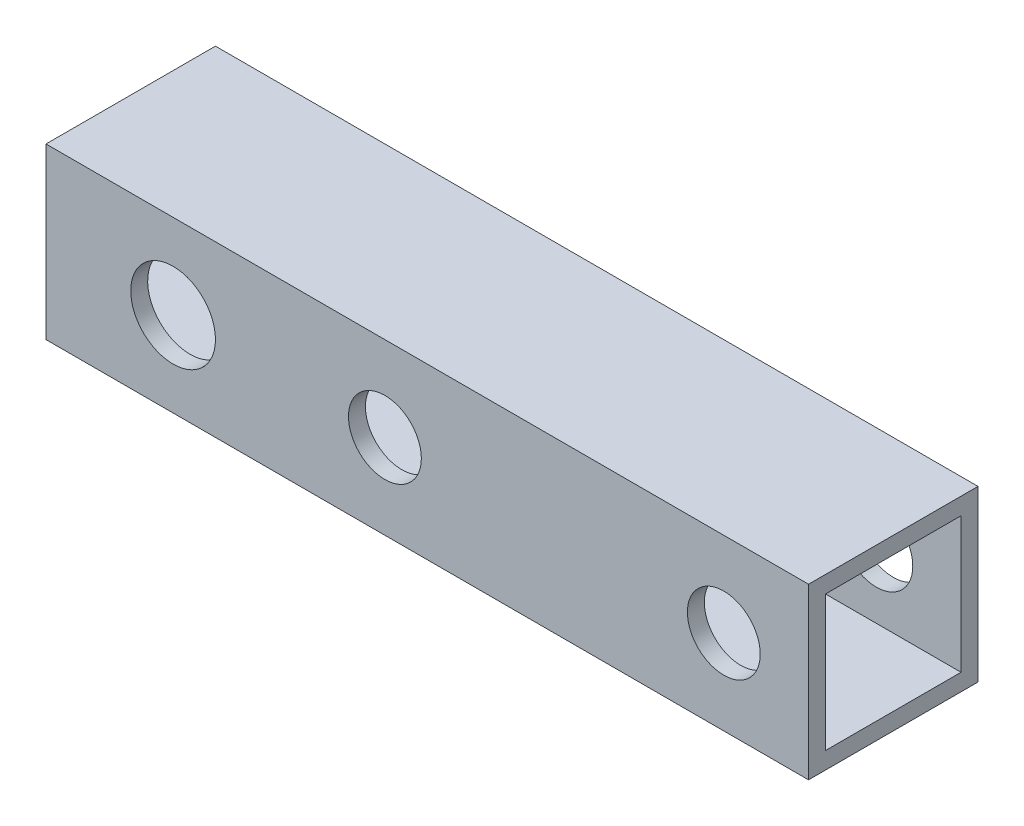
ISO-10303-21;
HEADER;
FILE_DESCRIPTION(('STEP AP214'),'2;1');
FILE_NAME('part.step','',(''),(''),'','','');
FILE_SCHEMA(('AUTOMOTIVE_DESIGN { 1 0 10303 214 1 1 1 1 }'));
ENDSEC;
DATA;
#1=APPLICATION_CONTEXT('core data for automotive mechanical design processes');
#2=APPLICATION_PROTOCOL_DEFINITION('international standard','automotive_design',2000,#1);
#3=PRODUCT_CONTEXT('',#1,'mechanical');
#4=PRODUCT('Part','Part','',(#3));
#5=PRODUCT_RELATED_PRODUCT_CATEGORY('part','',(#4));
#6=PRODUCT_DEFINITION_FORMATION('','',#4);
#7=PRODUCT_DEFINITION_CONTEXT('part definition',#1,'design');
#8=PRODUCT_DEFINITION('design','',#6,#7);
#9=PRODUCT_DEFINITION_SHAPE('','',#8);
#10=(LENGTH_UNIT() NAMED_UNIT(*) SI_UNIT(.MILLI.,.METRE.));
#11=(NAMED_UNIT(*) PLANE_ANGLE_UNIT() SI_UNIT($,.RADIAN.));
#12=(NAMED_UNIT(*) SI_UNIT($,.STERADIAN.) SOLID_ANGLE_UNIT());
#13=UNCERTAINTY_MEASURE_WITH_UNIT(LENGTH_MEASURE(1.E-05),#10,'distance_accuracy_value','');
#14=(GEOMETRIC_REPRESENTATION_CONTEXT(3) GLOBAL_UNCERTAINTY_ASSIGNED_CONTEXT((#13)) GLOBAL_UNIT_ASSIGNED_CONTEXT((#10,
#11,#12)) REPRESENTATION_CONTEXT('',''));
#15=CARTESIAN_POINT('',(0.,0.,0.));
#16=DIRECTION('',(0.,0.,1.));
#17=DIRECTION('',(1.,0.,0.));
#18=AXIS2_PLACEMENT_3D('',#15,#16,#17);
#19=CARTESIAN_POINT('',(45.,0.,0.));
#20=DIRECTION('',(1.,0.,0.));
#21=DIRECTION('',(0.,0.,-1.));
#22=AXIS2_PLACEMENT_3D('',#19,#20,#21);
#23=PLANE('',#22);
#24=DIRECTION('',(0.,1.,0.));
#25=VECTOR('',#24,1.);
#26=CARTESIAN_POINT('',(45.,5.,-5.));
#27=LINE('',#26,#25);
#28=CARTESIAN_POINT('',(45.,-5.,-5.));
#29=VERTEX_POINT('',#28);
#30=CARTESIAN_POINT('',(45.,5.,-5.));
#31=VERTEX_POINT('',#30);
#32=EDGE_CURVE('E164',#29,#31,#27,.T.);
#33=ORIENTED_EDGE('',*,*,#32,.T.);
#34=DIRECTION('',(0.,0.,1.));
#35=VECTOR('',#34,1.);
#36=CARTESIAN_POINT('',(45.,5.,5.));
#37=LINE('',#36,#35);
#38=CARTESIAN_POINT('',(45.,5.,5.));
#39=VERTEX_POINT('',#38);
#40=EDGE_CURVE('E167',#31,#39,#37,.T.);
#41=ORIENTED_EDGE('',*,*,#40,.T.);
#42=DIRECTION('',(0.,-1.,0.));
#43=VECTOR('',#42,1.);
#44=CARTESIAN_POINT('',(45.,5.,5.));
#45=LINE('',#44,#43);
#46=CARTESIAN_POINT('',(45.,-5.,5.));
#47=VERTEX_POINT('',#46);
#48=EDGE_CURVE('E170',#39,#47,#45,.T.);
#49=ORIENTED_EDGE('',*,*,#48,.T.);
#50=DIRECTION('',(0.,0.,-1.));
#51=VECTOR('',#50,1.);
#52=CARTESIAN_POINT('',(45.,-5.,5.));
#53=LINE('',#52,#51);
#54=EDGE_CURVE('E172',#47,#29,#53,.T.);
#55=ORIENTED_EDGE('',*,*,#54,.T.);
#56=EDGE_LOOP('',(#33,#41,#49,#55));
#57=FACE_BOUND('',#56,.T.);
#58=DIRECTION('',(0.,0.,1.));
#59=VECTOR('',#58,1.);
#60=CARTESIAN_POINT('',(45.,4.,5.));
#61=LINE('',#60,#59);
#62=CARTESIAN_POINT('',(45.,4.,-4.));
#63=VERTEX_POINT('',#62);
#64=CARTESIAN_POINT('',(45.,4.,4.));
#65=VERTEX_POINT('',#64);
#66=EDGE_CURVE('E134',#63,#65,#61,.T.);
#67=ORIENTED_EDGE('',*,*,#66,.F.);
#68=DIRECTION('',(0.,1.,0.));
#69=VECTOR('',#68,1.);
#70=CARTESIAN_POINT('',(45.,5.,-4.));
#71=LINE('',#70,#69);
#72=CARTESIAN_POINT('',(45.,-4.,-4.));
#73=VERTEX_POINT('',#72);
#74=EDGE_CURVE('E126',#73,#63,#71,.T.);
#75=ORIENTED_EDGE('',*,*,#74,.F.);
#76=DIRECTION('',(0.,0.,-1.));
#77=VECTOR('',#76,1.);
#78=CARTESIAN_POINT('',(45.,-4.,5.));
#79=LINE('',#78,#77);
#80=CARTESIAN_POINT('',(45.,-4.,4.));
#81=VERTEX_POINT('',#80);
#82=EDGE_CURVE('E148',#81,#73,#79,.T.);
#83=ORIENTED_EDGE('',*,*,#82,.F.);
#84=DIRECTION('',(0.,-1.,0.));
#85=VECTOR('',#84,1.);
#86=CARTESIAN_POINT('',(45.,5.,4.));
#87=LINE('',#86,#85);
#88=EDGE_CURVE('E146',#65,#81,#87,.T.);
#89=ORIENTED_EDGE('',*,*,#88,.F.);
#90=EDGE_LOOP('',(#67,#75,#83,#89));
#91=FACE_BOUND('',#90,.T.);
#92=ADVANCED_FACE('F59',(#57,#91),#23,.T.);
#93=CARTESIAN_POINT('',(0.,0.,0.));
#94=DIRECTION('',(1.,0.,0.));
#95=DIRECTION('',(0.,0.,-1.));
#96=AXIS2_PLACEMENT_3D('',#93,#94,#95);
#97=PLANE('',#96);
#98=DIRECTION('',(0.,1.,0.));
#99=VECTOR('',#98,1.);
#100=CARTESIAN_POINT('',(0.,5.,-5.));
#101=LINE('',#100,#99);
#102=CARTESIAN_POINT('',(0.,-5.,-5.));
#103=VERTEX_POINT('',#102);
#104=CARTESIAN_POINT('',(0.,5.,-5.));
#105=VERTEX_POINT('',#104);
#106=EDGE_CURVE('E142',#103,#105,#101,.T.);
#107=ORIENTED_EDGE('',*,*,#106,.F.);
#108=DIRECTION('',(0.,0.,-1.));
#109=VECTOR('',#108,1.);
#110=CARTESIAN_POINT('',(0.,-5.,5.));
#111=LINE('',#110,#109);
#112=CARTESIAN_POINT('',(0.,-5.,5.));
#113=VERTEX_POINT('',#112);
#114=EDGE_CURVE('E168',#113,#103,#111,.T.);
#115=ORIENTED_EDGE('',*,*,#114,.F.);
#116=DIRECTION('',(0.,-1.,0.));
#117=VECTOR('',#116,1.);
#118=CARTESIAN_POINT('',(0.,5.,5.));
#119=LINE('',#118,#117);
#120=CARTESIAN_POINT('',(0.,5.,5.));
#121=VERTEX_POINT('',#120);
#122=EDGE_CURVE('E179',#121,#113,#119,.T.);
#123=ORIENTED_EDGE('',*,*,#122,.F.);
#124=DIRECTION('',(0.,0.,1.));
#125=VECTOR('',#124,1.);
#126=CARTESIAN_POINT('',(0.,5.,5.));
#127=LINE('',#126,#125);
#128=EDGE_CURVE('E177',#105,#121,#127,.T.);
#129=ORIENTED_EDGE('',*,*,#128,.F.);
#130=EDGE_LOOP('',(#107,#115,#123,#129));
#131=FACE_BOUND('',#130,.T.);
#132=DIRECTION('',(0.,1.,0.));
#133=VECTOR('',#132,1.);
#134=CARTESIAN_POINT('',(0.,5.,-4.));
#135=LINE('',#134,#133);
#136=CARTESIAN_POINT('',(0.,-4.,-4.));
#137=VERTEX_POINT('',#136);
#138=CARTESIAN_POINT('',(0.,4.,-4.));
#139=VERTEX_POINT('',#138);
#140=EDGE_CURVE('E84',#137,#139,#135,.T.);
#141=ORIENTED_EDGE('',*,*,#140,.T.);
#142=DIRECTION('',(0.,0.,1.));
#143=VECTOR('',#142,1.);
#144=CARTESIAN_POINT('',(0.,4.,5.));
#145=LINE('',#144,#143);
#146=CARTESIAN_POINT('',(0.,4.,4.));
#147=VERTEX_POINT('',#146);
#148=EDGE_CURVE('E141',#139,#147,#145,.T.);
#149=ORIENTED_EDGE('',*,*,#148,.T.);
#150=DIRECTION('',(0.,-1.,0.));
#151=VECTOR('',#150,1.);
#152=CARTESIAN_POINT('',(0.,5.,4.));
#153=LINE('',#152,#151);
#154=CARTESIAN_POINT('',(0.,-4.,4.));
#155=VERTEX_POINT('',#154);
#156=EDGE_CURVE('E156',#147,#155,#153,.T.);
#157=ORIENTED_EDGE('',*,*,#156,.T.);
#158=DIRECTION('',(0.,0.,-1.));
#159=VECTOR('',#158,1.);
#160=CARTESIAN_POINT('',(0.,-4.,5.));
#161=LINE('',#160,#159);
#162=EDGE_CURVE('E135',#155,#137,#161,.T.);
#163=ORIENTED_EDGE('',*,*,#162,.T.);
#164=EDGE_LOOP('',(#141,#149,#157,#163));
#165=FACE_BOUND('',#164,.T.);
#166=ADVANCED_FACE('F226',(#131,#165),#97,.F.);
#167=CARTESIAN_POINT('',(45.,5.,-5.));
#168=DIRECTION('',(0.,0.,1.));
#169=DIRECTION('',(0.,-1.,0.));
#170=AXIS2_PLACEMENT_3D('',#167,#168,#169);
#171=PLANE('',#170);
#172=CARTESIAN_POINT('',(40.,0.,-5.));
#173=DIRECTION('',(0.,0.,1.));
#174=DIRECTION('',(1.,0.,0.));
#175=AXIS2_PLACEMENT_3D('',#172,#173,#174);
#176=CIRCLE('',#175,2.14999999999996);
#177=CARTESIAN_POINT('',(42.1499999999999,0.,-5.));
#178=VERTEX_POINT('',#177);
#179=EDGE_CURVE('E192',#178,#178,#176,.T.);
#180=ORIENTED_EDGE('',*,*,#179,.T.);
#181=EDGE_LOOP('',(#180));
#182=FACE_BOUND('',#181,.T.);
#183=CARTESIAN_POINT('',(20.,0.,-5.));
#184=DIRECTION('',(0.,0.,1.));
#185=DIRECTION('',(1.,0.,0.));
#186=AXIS2_PLACEMENT_3D('',#183,#184,#185);
#187=CIRCLE('',#186,2.14999999999996);
#188=CARTESIAN_POINT('',(22.1499999999999,0.,-5.));
#189=VERTEX_POINT('',#188);
#190=EDGE_CURVE('E282',#189,#189,#187,.T.);
#191=ORIENTED_EDGE('',*,*,#190,.T.);
#192=EDGE_LOOP('',(#191));
#193=FACE_BOUND('',#192,.T.);
#194=CARTESIAN_POINT('',(7.50000000000001,0.,-5.));
#195=DIRECTION('',(0.,0.,1.));
#196=DIRECTION('',(1.,0.,0.));
#197=AXIS2_PLACEMENT_3D('',#194,#195,#196);
#198=CIRCLE('',#197,2.50000000000002);
#199=CARTESIAN_POINT('',(10.,0.,-5.));
#200=VERTEX_POINT('',#199);
#201=EDGE_CURVE('E285',#200,#200,#198,.T.);
#202=ORIENTED_EDGE('',*,*,#201,.T.);
#203=EDGE_LOOP('',(#202));
#204=FACE_BOUND('',#203,.T.);
#205=ORIENTED_EDGE('',*,*,#106,.T.);
#206=DIRECTION('',(-1.,0.,0.));
#207=VECTOR('',#206,1.);
#208=CARTESIAN_POINT('',(45.,5.,-5.));
#209=LINE('',#208,#207);
#210=EDGE_CURVE('E12',#31,#105,#209,.T.);
#211=ORIENTED_EDGE('',*,*,#210,.F.);
#212=ORIENTED_EDGE('',*,*,#32,.F.);
#213=DIRECTION('',(-1.,0.,0.));
#214=VECTOR('',#213,1.);
#215=CARTESIAN_POINT('',(45.,-5.,-5.));
#216=LINE('',#215,#214);
#217=EDGE_CURVE('E174',#29,#103,#216,.T.);
#218=ORIENTED_EDGE('',*,*,#217,.T.);
#219=EDGE_LOOP('',(#205,#211,#212,#218));
#220=FACE_BOUND('',#219,.T.);
#221=ADVANCED_FACE('F61',(#182,#193,#204,#220),#171,.F.);
#222=CARTESIAN_POINT('',(45.,5.,5.));
#223=DIRECTION('',(0.,-1.,0.));
#224=DIRECTION('',(0.,0.,-1.));
#225=AXIS2_PLACEMENT_3D('',#222,#223,#224);
#226=PLANE('',#225);
#227=ORIENTED_EDGE('',*,*,#128,.T.);
#228=DIRECTION('',(-1.,0.,0.));
#229=VECTOR('',#228,1.);
#230=CARTESIAN_POINT('',(45.,5.,5.));
#231=LINE('',#230,#229);
#232=EDGE_CURVE('E68',#39,#121,#231,.T.);
#233=ORIENTED_EDGE('',*,*,#232,.F.);
#234=ORIENTED_EDGE('',*,*,#40,.F.);
#235=ORIENTED_EDGE('',*,*,#210,.T.);
#236=EDGE_LOOP('',(#227,#233,#234,#235));
#237=FACE_BOUND('',#236,.T.);
#238=ADVANCED_FACE('F254',(#237),#226,.F.);
#239=CARTESIAN_POINT('',(45.,5.,5.));
#240=DIRECTION('',(0.,0.,-1.));
#241=DIRECTION('',(0.,1.,0.));
#242=AXIS2_PLACEMENT_3D('',#239,#240,#241);
#243=PLANE('',#242);
#244=CARTESIAN_POINT('',(40.,0.,5.));
#245=DIRECTION('',(0.,0.,1.));
#246=DIRECTION('',(1.,0.,0.));
#247=AXIS2_PLACEMENT_3D('',#244,#245,#246);
#248=CIRCLE('',#247,2.14999999999996);
#249=CARTESIAN_POINT('',(42.1499999999999,0.,5.));
#250=VERTEX_POINT('',#249);
#251=EDGE_CURVE('E293',#250,#250,#248,.T.);
#252=ORIENTED_EDGE('',*,*,#251,.F.);
#253=EDGE_LOOP('',(#252));
#254=FACE_BOUND('',#253,.T.);
#255=CARTESIAN_POINT('',(20.,0.,5.));
#256=DIRECTION('',(0.,0.,1.));
#257=DIRECTION('',(1.,0.,0.));
#258=AXIS2_PLACEMENT_3D('',#255,#256,#257);
#259=CIRCLE('',#258,2.14999999999996);
#260=CARTESIAN_POINT('',(22.1499999999999,0.,5.));
#261=VERTEX_POINT('',#260);
#262=EDGE_CURVE('E287',#261,#261,#259,.T.);
#263=ORIENTED_EDGE('',*,*,#262,.F.);
#264=EDGE_LOOP('',(#263));
#265=FACE_BOUND('',#264,.T.);
#266=CARTESIAN_POINT('',(7.50000000000001,0.,5.));
#267=DIRECTION('',(0.,0.,1.));
#268=DIRECTION('',(1.,0.,0.));
#269=AXIS2_PLACEMENT_3D('',#266,#267,#268);
#270=CIRCLE('',#269,2.50000000000002);
#271=CARTESIAN_POINT('',(10.,0.,5.));
#272=VERTEX_POINT('',#271);
#273=EDGE_CURVE('E205',#272,#272,#270,.T.);
#274=ORIENTED_EDGE('',*,*,#273,.F.);
#275=EDGE_LOOP('',(#274));
#276=FACE_BOUND('',#275,.T.);
#277=ORIENTED_EDGE('',*,*,#122,.T.);
#278=DIRECTION('',(-1.,0.,0.));
#279=VECTOR('',#278,1.);
#280=CARTESIAN_POINT('',(45.,-5.,5.));
#281=LINE('',#280,#279);
#282=EDGE_CURVE('E184',#47,#113,#281,.T.);
#283=ORIENTED_EDGE('',*,*,#282,.F.);
#284=ORIENTED_EDGE('',*,*,#48,.F.);
#285=ORIENTED_EDGE('',*,*,#232,.T.);
#286=EDGE_LOOP('',(#277,#283,#284,#285));
#287=FACE_BOUND('',#286,.T.);
#288=ADVANCED_FACE('F251',(#254,#265,#276,#287),#243,.F.);
#289=CARTESIAN_POINT('',(45.,-5.,5.));
#290=DIRECTION('',(0.,1.,0.));
#291=DIRECTION('',(0.,0.,1.));
#292=AXIS2_PLACEMENT_3D('',#289,#290,#291);
#293=PLANE('',#292);
#294=ORIENTED_EDGE('',*,*,#114,.T.);
#295=ORIENTED_EDGE('',*,*,#217,.F.);
#296=ORIENTED_EDGE('',*,*,#54,.F.);
#297=ORIENTED_EDGE('',*,*,#282,.T.);
#298=EDGE_LOOP('',(#294,#295,#296,#297));
#299=FACE_BOUND('',#298,.T.);
#300=ADVANCED_FACE('F248',(#299),#293,.F.);
#301=CARTESIAN_POINT('',(45.,5.,-4.));
#302=DIRECTION('',(0.,0.,1.));
#303=DIRECTION('',(0.,-1.,0.));
#304=AXIS2_PLACEMENT_3D('',#301,#302,#303);
#305=PLANE('',#304);
#306=CARTESIAN_POINT('',(40.,0.,-4.));
#307=DIRECTION('',(0.,0.,1.));
#308=DIRECTION('',(0.,-1.,0.));
#309=AXIS2_PLACEMENT_3D('',#306,#307,#308);
#310=CIRCLE('',#309,2.14999999999996);
#311=CARTESIAN_POINT('',(40.,-2.15000000000002,-4.));
#312=VERTEX_POINT('',#311);
#313=EDGE_CURVE('E154',#312,#312,#310,.T.);
#314=ORIENTED_EDGE('',*,*,#313,.F.);
#315=EDGE_LOOP('',(#314));
#316=FACE_BOUND('',#315,.T.);
#317=CARTESIAN_POINT('',(20.,0.,-4.));
#318=DIRECTION('',(0.,0.,1.));
#319=DIRECTION('',(0.,-1.,0.));
#320=AXIS2_PLACEMENT_3D('',#317,#318,#319);
#321=CIRCLE('',#320,2.14999999999996);
#322=CARTESIAN_POINT('',(20.,-2.15000000000002,-4.));
#323=VERTEX_POINT('',#322);
#324=EDGE_CURVE('E195',#323,#323,#321,.T.);
#325=ORIENTED_EDGE('',*,*,#324,.F.);
#326=EDGE_LOOP('',(#325));
#327=FACE_BOUND('',#326,.T.);
#328=CARTESIAN_POINT('',(7.50000000000001,0.,-4.));
#329=DIRECTION('',(0.,0.,1.));
#330=DIRECTION('',(0.,-1.,0.));
#331=AXIS2_PLACEMENT_3D('',#328,#329,#330);
#332=CIRCLE('',#331,2.50000000000002);
#333=CARTESIAN_POINT('',(7.50000000000001,-2.50000000000008,-4.));
#334=VERTEX_POINT('',#333);
#335=EDGE_CURVE('E191',#334,#334,#332,.T.);
#336=ORIENTED_EDGE('',*,*,#335,.F.);
#337=EDGE_LOOP('',(#336));
#338=FACE_BOUND('',#337,.T.);
#339=ORIENTED_EDGE('',*,*,#140,.F.);
#340=DIRECTION('',(-1.,0.,0.));
#341=VECTOR('',#340,1.);
#342=CARTESIAN_POINT('',(45.,-4.,-4.));
#343=LINE('',#342,#341);
#344=EDGE_CURVE('E130',#73,#137,#343,.T.);
#345=ORIENTED_EDGE('',*,*,#344,.F.);
#346=ORIENTED_EDGE('',*,*,#74,.T.);
#347=DIRECTION('',(-1.,0.,0.));
#348=VECTOR('',#347,1.);
#349=CARTESIAN_POINT('',(45.,4.,-4.));
#350=LINE('',#349,#348);
#351=EDGE_CURVE('E129',#63,#139,#350,.T.);
#352=ORIENTED_EDGE('',*,*,#351,.T.);
#353=EDGE_LOOP('',(#339,#345,#346,#352));
#354=FACE_BOUND('',#353,.T.);
#355=ADVANCED_FACE('F128',(#316,#327,#338,#354),#305,.T.);
#356=CARTESIAN_POINT('',(45.,4.,5.));
#357=DIRECTION('',(0.,-1.,0.));
#358=DIRECTION('',(0.,0.,-1.));
#359=AXIS2_PLACEMENT_3D('',#356,#357,#358);
#360=PLANE('',#359);
#361=ORIENTED_EDGE('',*,*,#148,.F.);
#362=ORIENTED_EDGE('',*,*,#351,.F.);
#363=ORIENTED_EDGE('',*,*,#66,.T.);
#364=DIRECTION('',(-1.,0.,0.));
#365=VECTOR('',#364,1.);
#366=CARTESIAN_POINT('',(45.,4.,4.));
#367=LINE('',#366,#365);
#368=EDGE_CURVE('E143',#65,#147,#367,.T.);
#369=ORIENTED_EDGE('',*,*,#368,.T.);
#370=EDGE_LOOP('',(#361,#362,#363,#369));
#371=FACE_BOUND('',#370,.T.);
#372=ADVANCED_FACE('F138',(#371),#360,.T.);
#373=CARTESIAN_POINT('',(45.,5.,4.));
#374=DIRECTION('',(0.,0.,-1.));
#375=DIRECTION('',(0.,1.,0.));
#376=AXIS2_PLACEMENT_3D('',#373,#374,#375);
#377=PLANE('',#376);
#378=CARTESIAN_POINT('',(40.,0.,4.));
#379=DIRECTION('',(0.,0.,-1.));
#380=DIRECTION('',(0.,1.,0.));
#381=AXIS2_PLACEMENT_3D('',#378,#379,#380);
#382=CIRCLE('',#381,2.14999999999996);
#383=CARTESIAN_POINT('',(40.,2.1499999999999,4.));
#384=VERTEX_POINT('',#383);
#385=EDGE_CURVE('E63',#384,#384,#382,.T.);
#386=ORIENTED_EDGE('',*,*,#385,.F.);
#387=EDGE_LOOP('',(#386));
#388=FACE_BOUND('',#387,.T.);
#389=CARTESIAN_POINT('',(20.,0.,4.));
#390=DIRECTION('',(0.,0.,-1.));
#391=DIRECTION('',(0.,1.,0.));
#392=AXIS2_PLACEMENT_3D('',#389,#390,#391);
#393=CIRCLE('',#392,2.14999999999996);
#394=CARTESIAN_POINT('',(20.,2.1499999999999,4.));
#395=VERTEX_POINT('',#394);
#396=EDGE_CURVE('E193',#395,#395,#393,.T.);
#397=ORIENTED_EDGE('',*,*,#396,.F.);
#398=EDGE_LOOP('',(#397));
#399=FACE_BOUND('',#398,.T.);
#400=CARTESIAN_POINT('',(7.50000000000001,0.,4.));
#401=DIRECTION('',(0.,0.,-1.));
#402=DIRECTION('',(0.,1.,0.));
#403=AXIS2_PLACEMENT_3D('',#400,#401,#402);
#404=CIRCLE('',#403,2.50000000000002);
#405=CARTESIAN_POINT('',(7.50000000000001,2.49999999999996,4.));
#406=VERTEX_POINT('',#405);
#407=EDGE_CURVE('E189',#406,#406,#404,.T.);
#408=ORIENTED_EDGE('',*,*,#407,.F.);
#409=EDGE_LOOP('',(#408));
#410=FACE_BOUND('',#409,.T.);
#411=ORIENTED_EDGE('',*,*,#156,.F.);
#412=ORIENTED_EDGE('',*,*,#368,.F.);
#413=ORIENTED_EDGE('',*,*,#88,.T.);
#414=DIRECTION('',(-1.,0.,0.));
#415=VECTOR('',#414,1.);
#416=CARTESIAN_POINT('',(45.,-4.,4.));
#417=LINE('',#416,#415);
#418=EDGE_CURVE('E76',#81,#155,#417,.T.);
#419=ORIENTED_EDGE('',*,*,#418,.T.);
#420=EDGE_LOOP('',(#411,#412,#413,#419));
#421=FACE_BOUND('',#420,.T.);
#422=ADVANCED_FACE('F216',(#388,#399,#410,#421),#377,.T.);
#423=CARTESIAN_POINT('',(45.,-4.,5.));
#424=DIRECTION('',(0.,1.,0.));
#425=DIRECTION('',(0.,0.,1.));
#426=AXIS2_PLACEMENT_3D('',#423,#424,#425);
#427=PLANE('',#426);
#428=ORIENTED_EDGE('',*,*,#162,.F.);
#429=ORIENTED_EDGE('',*,*,#418,.F.);
#430=ORIENTED_EDGE('',*,*,#82,.T.);
#431=ORIENTED_EDGE('',*,*,#344,.T.);
#432=EDGE_LOOP('',(#428,#429,#430,#431));
#433=FACE_BOUND('',#432,.T.);
#434=ADVANCED_FACE('F219',(#433),#427,.T.);
#435=CARTESIAN_POINT('',(7.50000000000001,0.,-5.));
#436=DIRECTION('',(0.,0.,1.));
#437=DIRECTION('',(1.,0.,0.));
#438=AXIS2_PLACEMENT_3D('',#435,#436,#437);
#439=CYLINDRICAL_SURFACE('',#438,2.50000000000002);
#440=ORIENTED_EDGE('',*,*,#407,.T.);
#441=EDGE_LOOP('',(#440));
#442=FACE_BOUND('',#441,.T.);
#443=ORIENTED_EDGE('',*,*,#273,.T.);
#444=EDGE_LOOP('',(#443));
#445=FACE_BOUND('',#444,.T.);
#446=ADVANCED_FACE('F228',(#442,#445),#439,.F.);
#447=CARTESIAN_POINT('',(20.,0.,-5.));
#448=DIRECTION('',(0.,0.,1.));
#449=DIRECTION('',(1.,0.,0.));
#450=AXIS2_PLACEMENT_3D('',#447,#448,#449);
#451=CYLINDRICAL_SURFACE('',#450,2.14999999999996);
#452=ORIENTED_EDGE('',*,*,#396,.T.);
#453=EDGE_LOOP('',(#452));
#454=FACE_BOUND('',#453,.T.);
#455=ORIENTED_EDGE('',*,*,#262,.T.);
#456=EDGE_LOOP('',(#455));
#457=FACE_BOUND('',#456,.T.);
#458=ADVANCED_FACE('F233',(#454,#457),#451,.F.);
#459=CARTESIAN_POINT('',(40.,0.,-5.));
#460=DIRECTION('',(0.,0.,1.));
#461=DIRECTION('',(1.,0.,0.));
#462=AXIS2_PLACEMENT_3D('',#459,#460,#461);
#463=CYLINDRICAL_SURFACE('',#462,2.14999999999996);
#464=ORIENTED_EDGE('',*,*,#385,.T.);
#465=EDGE_LOOP('',(#464));
#466=FACE_BOUND('',#465,.T.);
#467=ORIENTED_EDGE('',*,*,#251,.T.);
#468=EDGE_LOOP('',(#467));
#469=FACE_BOUND('',#468,.T.);
#470=ADVANCED_FACE('F213',(#466,#469),#463,.F.);
#471=ORIENTED_EDGE('',*,*,#335,.T.);
#472=EDGE_LOOP('',(#471));
#473=FACE_BOUND('',#472,.T.);
#474=ORIENTED_EDGE('',*,*,#201,.F.);
#475=EDGE_LOOP('',(#474));
#476=FACE_BOUND('',#475,.T.);
#477=ADVANCED_FACE('F236',(#473,#476),#439,.F.);
#478=ORIENTED_EDGE('',*,*,#324,.T.);
#479=EDGE_LOOP('',(#478));
#480=FACE_BOUND('',#479,.T.);
#481=ORIENTED_EDGE('',*,*,#190,.F.);
#482=EDGE_LOOP('',(#481));
#483=FACE_BOUND('',#482,.T.);
#484=ADVANCED_FACE('F305',(#480,#483),#451,.F.);
#485=ORIENTED_EDGE('',*,*,#313,.T.);
#486=EDGE_LOOP('',(#485));
#487=FACE_BOUND('',#486,.T.);
#488=ORIENTED_EDGE('',*,*,#179,.F.);
#489=EDGE_LOOP('',(#488));
#490=FACE_BOUND('',#489,.T.);
#491=ADVANCED_FACE('F310',(#487,#490),#463,.F.);
#492=CLOSED_SHELL('',(#92,#166,#221,#238,#288,#300,#355,#372,#422,#434,#446,#458,#470,#477,#484,#491));
#493=MANIFOLD_SOLID_BREP('B2',#492);
#494=ADVANCED_BREP_SHAPE_REPRESENTATION('',(#18,#493),#14);
#495=SHAPE_DEFINITION_REPRESENTATION(#9,#494);
ENDSEC;
END-ISO-10303-21;
